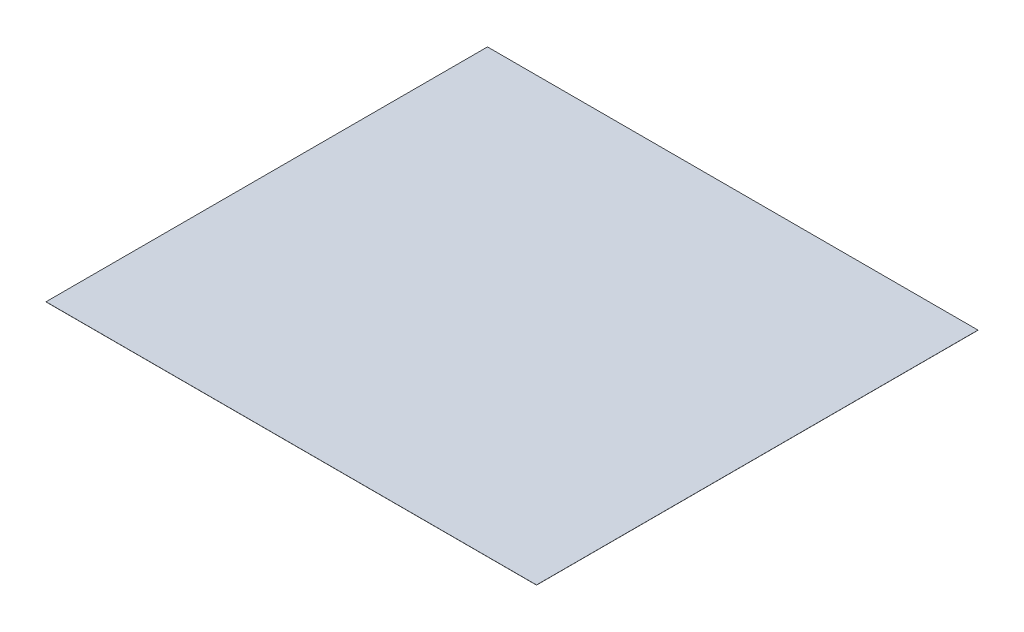
ISO-10303-21;
HEADER;
FILE_DESCRIPTION(('STEP AP214'),'2;1');
FILE_NAME('part.step','',(''),(''),'','','');
FILE_SCHEMA(('AUTOMOTIVE_DESIGN { 1 0 10303 214 1 1 1 1 }'));
ENDSEC;
DATA;
#1=APPLICATION_CONTEXT('core data for automotive mechanical design processes');
#2=APPLICATION_PROTOCOL_DEFINITION('international standard','automotive_design',2000,#1);
#3=PRODUCT_CONTEXT('',#1,'mechanical');
#4=PRODUCT('Part','Part','',(#3));
#5=PRODUCT_RELATED_PRODUCT_CATEGORY('part','',(#4));
#6=PRODUCT_DEFINITION_FORMATION('','',#4);
#7=PRODUCT_DEFINITION_CONTEXT('part definition',#1,'design');
#8=PRODUCT_DEFINITION('design','',#6,#7);
#9=PRODUCT_DEFINITION_SHAPE('','',#8);
#10=(LENGTH_UNIT() NAMED_UNIT(*) SI_UNIT(.MILLI.,.METRE.));
#11=(NAMED_UNIT(*) PLANE_ANGLE_UNIT() SI_UNIT($,.RADIAN.));
#12=(NAMED_UNIT(*) SI_UNIT($,.STERADIAN.) SOLID_ANGLE_UNIT());
#13=UNCERTAINTY_MEASURE_WITH_UNIT(LENGTH_MEASURE(1.E-05),#10,'distance_accuracy_value','');
#14=(GEOMETRIC_REPRESENTATION_CONTEXT(3) GLOBAL_UNCERTAINTY_ASSIGNED_CONTEXT((#13)) GLOBAL_UNIT_ASSIGNED_CONTEXT((#10,
#11,#12)) REPRESENTATION_CONTEXT('',''));
#15=CARTESIAN_POINT('',(0.,0.,0.));
#16=DIRECTION('',(0.,0.,1.));
#17=DIRECTION('',(1.,0.,0.));
#18=AXIS2_PLACEMENT_3D('',#15,#16,#17);
#19=CARTESIAN_POINT('',(-220.,0.1,-180.));
#20=DIRECTION('',(1.,0.,0.));
#21=DIRECTION('',(0.,0.,-1.));
#22=AXIS2_PLACEMENT_3D('',#19,#20,#21);
#23=PLANE('',#22);
#24=DIRECTION('',(0.,0.,1.));
#25=VECTOR('',#24,1.);
#26=CARTESIAN_POINT('',(-220.,0.,-180.));
#27=LINE('',#26,#25);
#28=CARTESIAN_POINT('',(-220.,0.,-180.));
#29=VERTEX_POINT('',#28);
#30=CARTESIAN_POINT('',(-220.,0.,180.));
#31=VERTEX_POINT('',#30);
#32=EDGE_CURVE('E97',#29,#31,#27,.T.);
#33=ORIENTED_EDGE('',*,*,#32,.T.);
#34=DIRECTION('',(0.,-1.,0.));
#35=VECTOR('',#34,1.);
#36=CARTESIAN_POINT('',(-220.,0.1,180.));
#37=LINE('',#36,#35);
#38=CARTESIAN_POINT('',(-220.,0.1,180.));
#39=VERTEX_POINT('',#38);
#40=EDGE_CURVE('E11',#39,#31,#37,.T.);
#41=ORIENTED_EDGE('',*,*,#40,.F.);
#42=DIRECTION('',(0.,0.,1.));
#43=VECTOR('',#42,1.);
#44=CARTESIAN_POINT('',(-220.,0.1,-180.));
#45=LINE('',#44,#43);
#46=CARTESIAN_POINT('',(-220.,0.1,-180.));
#47=VERTEX_POINT('',#46);
#48=EDGE_CURVE('E85',#47,#39,#45,.T.);
#49=ORIENTED_EDGE('',*,*,#48,.F.);
#50=DIRECTION('',(0.,-1.,0.));
#51=VECTOR('',#50,1.);
#52=CARTESIAN_POINT('',(-220.,0.1,-180.));
#53=LINE('',#52,#51);
#54=EDGE_CURVE('E93',#47,#29,#53,.T.);
#55=ORIENTED_EDGE('',*,*,#54,.T.);
#56=EDGE_LOOP('',(#33,#41,#49,#55));
#57=FACE_BOUND('',#56,.T.);
#58=ADVANCED_FACE('F34',(#57),#23,.F.);
#59=CARTESIAN_POINT('',(-220.,0.1,180.));
#60=DIRECTION('',(0.,0.,-1.));
#61=DIRECTION('',(-1.,0.,0.));
#62=AXIS2_PLACEMENT_3D('',#59,#60,#61);
#63=PLANE('',#62);
#64=DIRECTION('',(1.,0.,0.));
#65=VECTOR('',#64,1.);
#66=CARTESIAN_POINT('',(-220.,0.,180.));
#67=LINE('',#66,#65);
#68=CARTESIAN_POINT('',(180.,0.,180.));
#69=VERTEX_POINT('',#68);
#70=EDGE_CURVE('E89',#31,#69,#67,.T.);
#71=ORIENTED_EDGE('',*,*,#70,.T.);
#72=DIRECTION('',(0.,-1.,0.));
#73=VECTOR('',#72,1.);
#74=CARTESIAN_POINT('',(180.,0.1,180.));
#75=LINE('',#74,#73);
#76=CARTESIAN_POINT('',(180.,0.1,180.));
#77=VERTEX_POINT('',#76);
#78=EDGE_CURVE('E42',#77,#69,#75,.T.);
#79=ORIENTED_EDGE('',*,*,#78,.F.);
#80=DIRECTION('',(1.,0.,0.));
#81=VECTOR('',#80,1.);
#82=CARTESIAN_POINT('',(-220.,0.1,180.));
#83=LINE('',#82,#81);
#84=EDGE_CURVE('E80',#39,#77,#83,.T.);
#85=ORIENTED_EDGE('',*,*,#84,.F.);
#86=ORIENTED_EDGE('',*,*,#40,.T.);
#87=EDGE_LOOP('',(#71,#79,#85,#86));
#88=FACE_BOUND('',#87,.T.);
#89=ADVANCED_FACE('F88',(#88),#63,.F.);
#90=CARTESIAN_POINT('',(180.,0.1,-180.));
#91=DIRECTION('',(-1.,0.,0.));
#92=DIRECTION('',(0.,0.,1.));
#93=AXIS2_PLACEMENT_3D('',#90,#91,#92);
#94=PLANE('',#93);
#95=DIRECTION('',(0.,0.,-1.));
#96=VECTOR('',#95,1.);
#97=CARTESIAN_POINT('',(180.,0.,-180.));
#98=LINE('',#97,#96);
#99=CARTESIAN_POINT('',(180.,0.,-180.));
#100=VERTEX_POINT('',#99);
#101=EDGE_CURVE('E67',#69,#100,#98,.T.);
#102=ORIENTED_EDGE('',*,*,#101,.T.);
#103=DIRECTION('',(0.,-1.,0.));
#104=VECTOR('',#103,1.);
#105=CARTESIAN_POINT('',(180.,0.1,-180.));
#106=LINE('',#105,#104);
#107=CARTESIAN_POINT('',(180.,0.1,-180.));
#108=VERTEX_POINT('',#107);
#109=EDGE_CURVE('E90',#108,#100,#106,.T.);
#110=ORIENTED_EDGE('',*,*,#109,.F.);
#111=DIRECTION('',(0.,0.,-1.));
#112=VECTOR('',#111,1.);
#113=CARTESIAN_POINT('',(180.,0.1,-180.));
#114=LINE('',#113,#112);
#115=EDGE_CURVE('E83',#77,#108,#114,.T.);
#116=ORIENTED_EDGE('',*,*,#115,.F.);
#117=ORIENTED_EDGE('',*,*,#78,.T.);
#118=EDGE_LOOP('',(#102,#110,#116,#117));
#119=FACE_BOUND('',#118,.T.);
#120=ADVANCED_FACE('F91',(#119),#94,.F.);
#121=CARTESIAN_POINT('',(-220.,0.1,-180.));
#122=DIRECTION('',(0.,0.,1.));
#123=DIRECTION('',(1.,0.,0.));
#124=AXIS2_PLACEMENT_3D('',#121,#122,#123);
#125=PLANE('',#124);
#126=DIRECTION('',(-1.,0.,0.));
#127=VECTOR('',#126,1.);
#128=CARTESIAN_POINT('',(-220.,0.,-180.));
#129=LINE('',#128,#127);
#130=EDGE_CURVE('E73',#100,#29,#129,.T.);
#131=ORIENTED_EDGE('',*,*,#130,.T.);
#132=ORIENTED_EDGE('',*,*,#54,.F.);
#133=DIRECTION('',(-1.,0.,0.));
#134=VECTOR('',#133,1.);
#135=CARTESIAN_POINT('',(-220.,0.1,-180.));
#136=LINE('',#135,#134);
#137=EDGE_CURVE('E50',#108,#47,#136,.T.);
#138=ORIENTED_EDGE('',*,*,#137,.F.);
#139=ORIENTED_EDGE('',*,*,#109,.T.);
#140=EDGE_LOOP('',(#131,#132,#138,#139));
#141=FACE_BOUND('',#140,.T.);
#142=ADVANCED_FACE('F104',(#141),#125,.F.);
#143=CARTESIAN_POINT('',(0.,0.1,0.));
#144=DIRECTION('',(0.,1.,0.));
#145=DIRECTION('',(0.,0.,1.));
#146=AXIS2_PLACEMENT_3D('',#143,#144,#145);
#147=PLANE('',#146);
#148=ORIENTED_EDGE('',*,*,#48,.T.);
#149=ORIENTED_EDGE('',*,*,#84,.T.);
#150=ORIENTED_EDGE('',*,*,#115,.T.);
#151=ORIENTED_EDGE('',*,*,#137,.T.);
#152=EDGE_LOOP('',(#148,#149,#150,#151));
#153=FACE_BOUND('',#152,.T.);
#154=ADVANCED_FACE('F81',(#153),#147,.T.);
#155=CARTESIAN_POINT('',(0.,0.,0.));
#156=DIRECTION('',(0.,1.,0.));
#157=DIRECTION('',(0.,0.,1.));
#158=AXIS2_PLACEMENT_3D('',#155,#156,#157);
#159=PLANE('',#158);
#160=ORIENTED_EDGE('',*,*,#32,.F.);
#161=ORIENTED_EDGE('',*,*,#130,.F.);
#162=ORIENTED_EDGE('',*,*,#101,.F.);
#163=ORIENTED_EDGE('',*,*,#70,.F.);
#164=EDGE_LOOP('',(#160,#161,#162,#163));
#165=FACE_BOUND('',#164,.T.);
#166=ADVANCED_FACE('F107',(#165),#159,.F.);
#167=CLOSED_SHELL('',(#58,#89,#120,#142,#154,#166));
#168=MANIFOLD_SOLID_BREP('B2',#167);
#169=ADVANCED_BREP_SHAPE_REPRESENTATION('',(#18,#168),#14);
#170=SHAPE_DEFINITION_REPRESENTATION(#9,#169);
ENDSEC;
END-ISO-10303-21;
